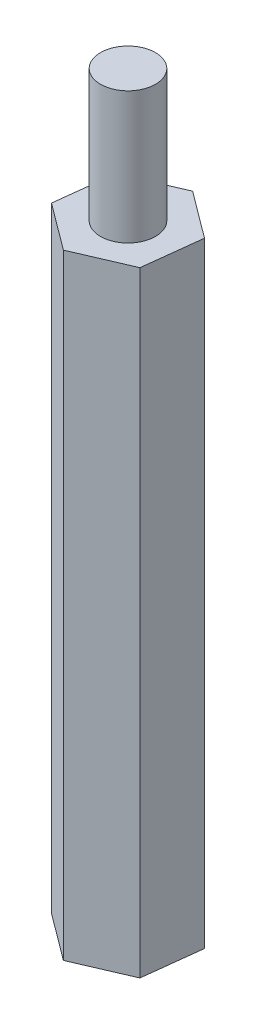
ISO-10303-21;
HEADER;
FILE_DESCRIPTION(('STEP AP214'),'2;1');
FILE_NAME('part.step','',(''),(''),'','','');
FILE_SCHEMA(('AUTOMOTIVE_DESIGN { 1 0 10303 214 1 1 1 1 }'));
ENDSEC;
DATA;
#1=APPLICATION_CONTEXT('core data for automotive mechanical design processes');
#2=APPLICATION_PROTOCOL_DEFINITION('international standard','automotive_design',2000,#1);
#3=PRODUCT_CONTEXT('',#1,'mechanical');
#4=PRODUCT('Part','Part','',(#3));
#5=PRODUCT_RELATED_PRODUCT_CATEGORY('part','',(#4));
#6=PRODUCT_DEFINITION_FORMATION('','',#4);
#7=PRODUCT_DEFINITION_CONTEXT('part definition',#1,'design');
#8=PRODUCT_DEFINITION('design','',#6,#7);
#9=PRODUCT_DEFINITION_SHAPE('','',#8);
#10=(LENGTH_UNIT() NAMED_UNIT(*) SI_UNIT(.MILLI.,.METRE.));
#11=(NAMED_UNIT(*) PLANE_ANGLE_UNIT() SI_UNIT($,.RADIAN.));
#12=(NAMED_UNIT(*) SI_UNIT($,.STERADIAN.) SOLID_ANGLE_UNIT());
#13=UNCERTAINTY_MEASURE_WITH_UNIT(LENGTH_MEASURE(1.E-05),#10,'distance_accuracy_value','');
#14=(GEOMETRIC_REPRESENTATION_CONTEXT(3) GLOBAL_UNCERTAINTY_ASSIGNED_CONTEXT((#13)) GLOBAL_UNIT_ASSIGNED_CONTEXT((#10,
#11,#12)) REPRESENTATION_CONTEXT('',''));
#15=CARTESIAN_POINT('',(0.,0.,0.));
#16=DIRECTION('',(0.,0.,1.));
#17=DIRECTION('',(1.,0.,0.));
#18=AXIS2_PLACEMENT_3D('',#15,#16,#17);
#19=CARTESIAN_POINT('',(-0.30848263547383,28.,2.63198375063584));
#20=DIRECTION('',(-0.395787953347626,0.,-0.918341927598265));
#21=DIRECTION('',(-0.918341927598265,0.,0.395787953347627));
#22=AXIS2_PLACEMENT_3D('',#19,#20,#21);
#23=PLANE('',#22);
#24=DIRECTION('',(0.918341927598265,0.,-0.395787953347626));
#25=VECTOR('',#24,1.);
#26=CARTESIAN_POINT('',(-0.30848263547383,0.,2.63198375063584));
#27=LINE('',#26,#25);
#28=CARTESIAN_POINT('',(-0.30848263547383,0.,2.63198375063584));
#29=VERTEX_POINT('',#28);
#30=CARTESIAN_POINT('',(2.12512347266157,0.,1.58314567426463));
#31=VERTEX_POINT('',#30);
#32=EDGE_CURVE('E125',#29,#31,#27,.T.);
#33=ORIENTED_EDGE('',*,*,#32,.T.);
#34=DIRECTION('',(0.,-1.,0.));
#35=VECTOR('',#34,1.);
#36=CARTESIAN_POINT('',(2.12512347266157,28.,1.58314567426463));
#37=LINE('',#36,#35);
#38=CARTESIAN_POINT('',(2.12512347266157,28.,1.58314567426463));
#39=VERTEX_POINT('',#38);
#40=EDGE_CURVE('E42',#39,#31,#37,.T.);
#41=ORIENTED_EDGE('',*,*,#40,.F.);
#42=DIRECTION('',(0.918341927598265,0.,-0.395787953347626));
#43=VECTOR('',#42,1.);
#44=CARTESIAN_POINT('',(-0.30848263547383,28.,2.63198375063584));
#45=LINE('',#44,#43);
#46=CARTESIAN_POINT('',(-0.30848263547383,28.,2.63198375063584));
#47=VERTEX_POINT('',#46);
#48=EDGE_CURVE('E136',#47,#39,#45,.T.);
#49=ORIENTED_EDGE('',*,*,#48,.F.);
#50=DIRECTION('',(0.,-1.,0.));
#51=VECTOR('',#50,1.);
#52=CARTESIAN_POINT('',(-0.30848263547383,28.,2.63198375063584));
#53=LINE('',#52,#51);
#54=EDGE_CURVE('E121',#47,#29,#53,.T.);
#55=ORIENTED_EDGE('',*,*,#54,.T.);
#56=EDGE_LOOP('',(#33,#41,#49,#55));
#57=FACE_BOUND('',#56,.T.);
#58=ADVANCED_FACE('F39',(#57),#23,.F.);
#59=CARTESIAN_POINT('',(2.12512347266157,28.,1.58314567426463));
#60=DIRECTION('',(-0.993201415334281,0.,-0.116408541688238));
#61=DIRECTION('',(-0.116408541688238,0.,0.993201415334281));
#62=AXIS2_PLACEMENT_3D('',#59,#60,#61);
#63=PLANE('',#62);
#64=DIRECTION('',(0.116408541688238,0.,-0.99320141533428));
#65=VECTOR('',#64,1.);
#66=CARTESIAN_POINT('',(2.12512347266157,0.,1.58314567426463));
#67=LINE('',#66,#65);
#68=CARTESIAN_POINT('',(2.4336061081354,0.,-1.04883807637121));
#69=VERTEX_POINT('',#68);
#70=EDGE_CURVE('E128',#31,#69,#67,.T.);
#71=ORIENTED_EDGE('',*,*,#70,.T.);
#72=DIRECTION('',(0.,-1.,0.));
#73=VECTOR('',#72,1.);
#74=CARTESIAN_POINT('',(2.4336061081354,28.,-1.04883807637121));
#75=LINE('',#74,#73);
#76=CARTESIAN_POINT('',(2.4336061081354,28.,-1.04883807637121));
#77=VERTEX_POINT('',#76);
#78=EDGE_CURVE('E139',#77,#69,#75,.T.);
#79=ORIENTED_EDGE('',*,*,#78,.F.);
#80=DIRECTION('',(0.116408541688238,0.,-0.99320141533428));
#81=VECTOR('',#80,1.);
#82=CARTESIAN_POINT('',(2.12512347266157,28.,1.58314567426463));
#83=LINE('',#82,#81);
#84=EDGE_CURVE('E94',#39,#77,#83,.T.);
#85=ORIENTED_EDGE('',*,*,#84,.F.);
#86=ORIENTED_EDGE('',*,*,#40,.T.);
#87=EDGE_LOOP('',(#71,#79,#85,#86));
#88=FACE_BOUND('',#87,.T.);
#89=ADVANCED_FACE('F144',(#88),#63,.F.);
#90=CARTESIAN_POINT('',(2.4336061081354,28.,-1.04883807637121));
#91=DIRECTION('',(-0.597413461986654,0.,0.801933385910027));
#92=DIRECTION('',(0.801933385910027,0.,0.597413461986654));
#93=AXIS2_PLACEMENT_3D('',#90,#91,#92);
#94=PLANE('',#93);
#95=DIRECTION('',(-0.801933385910027,0.,-0.597413461986654));
#96=VECTOR('',#95,1.);
#97=CARTESIAN_POINT('',(2.4336061081354,0.,-1.04883807637121));
#98=LINE('',#97,#96);
#99=CARTESIAN_POINT('',(0.308482635473831,0.,-2.63198375063584));
#100=VERTEX_POINT('',#99);
#101=EDGE_CURVE('E131',#69,#100,#98,.T.);
#102=ORIENTED_EDGE('',*,*,#101,.T.);
#103=DIRECTION('',(0.,-1.,0.));
#104=VECTOR('',#103,1.);
#105=CARTESIAN_POINT('',(0.308482635473831,28.,-2.63198375063584));
#106=LINE('',#105,#104);
#107=CARTESIAN_POINT('',(0.308482635473831,28.,-2.63198375063584));
#108=VERTEX_POINT('',#107);
#109=EDGE_CURVE('E116',#108,#100,#106,.T.);
#110=ORIENTED_EDGE('',*,*,#109,.F.);
#111=DIRECTION('',(-0.801933385910027,0.,-0.597413461986654));
#112=VECTOR('',#111,1.);
#113=CARTESIAN_POINT('',(2.4336061081354,28.,-1.04883807637121));
#114=LINE('',#113,#112);
#115=EDGE_CURVE('E107',#77,#108,#114,.T.);
#116=ORIENTED_EDGE('',*,*,#115,.F.);
#117=ORIENTED_EDGE('',*,*,#78,.T.);
#118=EDGE_LOOP('',(#102,#110,#116,#117));
#119=FACE_BOUND('',#118,.T.);
#120=ADVANCED_FACE('F150',(#119),#94,.F.);
#121=CARTESIAN_POINT('',(0.308482635473831,28.,-2.63198375063584));
#122=DIRECTION('',(0.395787953347626,0.,0.918341927598265));
#123=DIRECTION('',(0.918341927598265,0.,-0.395787953347626));
#124=AXIS2_PLACEMENT_3D('',#121,#122,#123);
#125=PLANE('',#124);
#126=DIRECTION('',(-0.918341927598265,0.,0.395787953347626));
#127=VECTOR('',#126,1.);
#128=CARTESIAN_POINT('',(0.308482635473831,0.,-2.63198375063584));
#129=LINE('',#128,#127);
#130=CARTESIAN_POINT('',(-2.12512347266157,0.,-1.58314567426463));
#131=VERTEX_POINT('',#130);
#132=EDGE_CURVE('E115',#100,#131,#129,.T.);
#133=ORIENTED_EDGE('',*,*,#132,.T.);
#134=DIRECTION('',(0.,-1.,0.));
#135=VECTOR('',#134,1.);
#136=CARTESIAN_POINT('',(-2.12512347266157,28.,-1.58314567426463));
#137=LINE('',#136,#135);
#138=CARTESIAN_POINT('',(-2.12512347266157,28.,-1.58314567426463));
#139=VERTEX_POINT('',#138);
#140=EDGE_CURVE('E112',#139,#131,#137,.T.);
#141=ORIENTED_EDGE('',*,*,#140,.F.);
#142=DIRECTION('',(-0.918341927598265,0.,0.395787953347626));
#143=VECTOR('',#142,1.);
#144=CARTESIAN_POINT('',(0.308482635473831,28.,-2.63198375063584));
#145=LINE('',#144,#143);
#146=EDGE_CURVE('E101',#108,#139,#145,.T.);
#147=ORIENTED_EDGE('',*,*,#146,.F.);
#148=ORIENTED_EDGE('',*,*,#109,.T.);
#149=EDGE_LOOP('',(#133,#141,#147,#148));
#150=FACE_BOUND('',#149,.T.);
#151=ADVANCED_FACE('F113',(#150),#125,.F.);
#152=CARTESIAN_POINT('',(-2.12512347266157,28.,-1.58314567426463));
#153=DIRECTION('',(0.993201415334281,0.,0.116408541688238));
#154=DIRECTION('',(0.116408541688238,0.,-0.993201415334281));
#155=AXIS2_PLACEMENT_3D('',#152,#153,#154);
#156=PLANE('',#155);
#157=DIRECTION('',(-0.116408541688238,0.,0.99320141533428));
#158=VECTOR('',#157,1.);
#159=CARTESIAN_POINT('',(-2.12512347266157,0.,-1.58314567426463));
#160=LINE('',#159,#158);
#161=CARTESIAN_POINT('',(-2.4336061081354,0.,1.04883807637121));
#162=VERTEX_POINT('',#161);
#163=EDGE_CURVE('E79',#131,#162,#160,.T.);
#164=ORIENTED_EDGE('',*,*,#163,.T.);
#165=DIRECTION('',(0.,-1.,0.));
#166=VECTOR('',#165,1.);
#167=CARTESIAN_POINT('',(-2.4336061081354,28.,1.04883807637121));
#168=LINE('',#167,#166);
#169=CARTESIAN_POINT('',(-2.4336061081354,28.,1.04883807637121));
#170=VERTEX_POINT('',#169);
#171=EDGE_CURVE('E117',#170,#162,#168,.T.);
#172=ORIENTED_EDGE('',*,*,#171,.F.);
#173=DIRECTION('',(-0.116408541688238,0.,0.99320141533428));
#174=VECTOR('',#173,1.);
#175=CARTESIAN_POINT('',(-2.12512347266157,28.,-1.58314567426463));
#176=LINE('',#175,#174);
#177=EDGE_CURVE('E105',#139,#170,#176,.T.);
#178=ORIENTED_EDGE('',*,*,#177,.F.);
#179=ORIENTED_EDGE('',*,*,#140,.T.);
#180=EDGE_LOOP('',(#164,#172,#178,#179));
#181=FACE_BOUND('',#180,.T.);
#182=ADVANCED_FACE('F119',(#181),#156,.F.);
#183=CARTESIAN_POINT('',(-2.4336061081354,28.,1.04883807637121));
#184=DIRECTION('',(0.597413461986654,0.,-0.801933385910027));
#185=DIRECTION('',(-0.801933385910027,0.,-0.597413461986654));
#186=AXIS2_PLACEMENT_3D('',#183,#184,#185);
#187=PLANE('',#186);
#188=DIRECTION('',(0.801933385910027,0.,0.597413461986654));
#189=VECTOR('',#188,1.);
#190=CARTESIAN_POINT('',(-2.4336061081354,0.,1.04883807637121));
#191=LINE('',#190,#189);
#192=EDGE_CURVE('E85',#162,#29,#191,.T.);
#193=ORIENTED_EDGE('',*,*,#192,.T.);
#194=ORIENTED_EDGE('',*,*,#54,.F.);
#195=DIRECTION('',(0.801933385910027,0.,0.597413461986654));
#196=VECTOR('',#195,1.);
#197=CARTESIAN_POINT('',(-2.4336061081354,28.,1.04883807637121));
#198=LINE('',#197,#196);
#199=EDGE_CURVE('E56',#170,#47,#198,.T.);
#200=ORIENTED_EDGE('',*,*,#199,.F.);
#201=ORIENTED_EDGE('',*,*,#171,.T.);
#202=EDGE_LOOP('',(#193,#194,#200,#201));
#203=FACE_BOUND('',#202,.T.);
#204=ADVANCED_FACE('F181',(#203),#187,.F.);
#205=CARTESIAN_POINT('',(0.,28.,0.));
#206=DIRECTION('',(0.,1.,0.));
#207=DIRECTION('',(0.,0.,1.));
#208=AXIS2_PLACEMENT_3D('',#205,#206,#207);
#209=PLANE('',#208);
#210=CARTESIAN_POINT('',(0.,28.,0.));
#211=DIRECTION('',(0.,1.,0.));
#212=DIRECTION('',(0.,0.,1.));
#213=AXIS2_PLACEMENT_3D('',#210,#211,#212);
#214=CIRCLE('',#213,1.25);
#215=CARTESIAN_POINT('',(0.,28.,1.25));
#216=VERTEX_POINT('',#215);
#217=EDGE_CURVE('E11',#216,#216,#214,.T.);
#218=ORIENTED_EDGE('',*,*,#217,.F.);
#219=EDGE_LOOP('',(#218));
#220=FACE_BOUND('',#219,.T.);
#221=ORIENTED_EDGE('',*,*,#48,.T.);
#222=ORIENTED_EDGE('',*,*,#84,.T.);
#223=ORIENTED_EDGE('',*,*,#115,.T.);
#224=ORIENTED_EDGE('',*,*,#146,.T.);
#225=ORIENTED_EDGE('',*,*,#177,.T.);
#226=ORIENTED_EDGE('',*,*,#199,.T.);
#227=EDGE_LOOP('',(#221,#222,#223,#224,#225,#226));
#228=FACE_BOUND('',#227,.T.);
#229=ADVANCED_FACE('F103',(#220,#228),#209,.T.);
#230=CARTESIAN_POINT('',(0.,0.,0.));
#231=DIRECTION('',(0.,1.,0.));
#232=DIRECTION('',(0.,0.,1.));
#233=AXIS2_PLACEMENT_3D('',#230,#231,#232);
#234=PLANE('',#233);
#235=CARTESIAN_POINT('',(0.,0.,0.));
#236=DIRECTION('',(0.,-1.,0.));
#237=DIRECTION('',(0.,0.,-1.));
#238=AXIS2_PLACEMENT_3D('',#235,#236,#237);
#239=CIRCLE('',#238,1.25);
#240=CARTESIAN_POINT('',(0.,0.,-1.25));
#241=VERTEX_POINT('',#240);
#242=EDGE_CURVE('E157',#241,#241,#239,.T.);
#243=ORIENTED_EDGE('',*,*,#242,.F.);
#244=EDGE_LOOP('',(#243));
#245=FACE_BOUND('',#244,.T.);
#246=ORIENTED_EDGE('',*,*,#32,.F.);
#247=ORIENTED_EDGE('',*,*,#192,.F.);
#248=ORIENTED_EDGE('',*,*,#163,.F.);
#249=ORIENTED_EDGE('',*,*,#132,.F.);
#250=ORIENTED_EDGE('',*,*,#101,.F.);
#251=ORIENTED_EDGE('',*,*,#70,.F.);
#252=EDGE_LOOP('',(#246,#247,#248,#249,#250,#251));
#253=FACE_BOUND('',#252,.T.);
#254=ADVANCED_FACE('F149',(#245,#253),#234,.F.);
#255=CARTESIAN_POINT('',(0.,34.,0.));
#256=DIRECTION('',(0.,-1.,0.));
#257=DIRECTION('',(0.,0.,-1.));
#258=AXIS2_PLACEMENT_3D('',#255,#256,#257);
#259=CYLINDRICAL_SURFACE('',#258,1.25);
#260=CARTESIAN_POINT('',(0.,34.,0.));
#261=DIRECTION('',(0.,1.,0.));
#262=DIRECTION('',(0.,0.,1.));
#263=AXIS2_PLACEMENT_3D('',#260,#261,#262);
#264=CIRCLE('',#263,1.25);
#265=CARTESIAN_POINT('',(0.,34.,1.25));
#266=VERTEX_POINT('',#265);
#267=EDGE_CURVE('E129',#266,#266,#264,.T.);
#268=ORIENTED_EDGE('',*,*,#267,.F.);
#269=EDGE_LOOP('',(#268));
#270=FACE_BOUND('',#269,.T.);
#271=ORIENTED_EDGE('',*,*,#217,.T.);
#272=EDGE_LOOP('',(#271));
#273=FACE_BOUND('',#272,.T.);
#274=ADVANCED_FACE('F173',(#270,#273),#259,.T.);
#275=CARTESIAN_POINT('',(0.,34.,0.));
#276=DIRECTION('',(0.,1.,0.));
#277=DIRECTION('',(0.,0.,1.));
#278=AXIS2_PLACEMENT_3D('',#275,#276,#277);
#279=PLANE('',#278);
#280=ORIENTED_EDGE('',*,*,#267,.T.);
#281=EDGE_LOOP('',(#280));
#282=FACE_BOUND('',#281,.T.);
#283=ADVANCED_FACE('F168',(#282),#279,.T.);
#284=CARTESIAN_POINT('',(0.,6.,0.));
#285=DIRECTION('',(0.,-1.,0.));
#286=DIRECTION('',(0.,0.,-1.));
#287=AXIS2_PLACEMENT_3D('',#284,#285,#286);
#288=CYLINDRICAL_SURFACE('',#287,1.25);
#289=CARTESIAN_POINT('',(0.,6.,0.));
#290=DIRECTION('',(0.,-1.,0.));
#291=DIRECTION('',(0.,0.,-1.));
#292=AXIS2_PLACEMENT_3D('',#289,#290,#291);
#293=CIRCLE('',#292,1.25);
#294=CARTESIAN_POINT('',(0.,6.,-1.25));
#295=VERTEX_POINT('',#294);
#296=EDGE_CURVE('E156',#295,#295,#293,.T.);
#297=ORIENTED_EDGE('',*,*,#296,.F.);
#298=EDGE_LOOP('',(#297));
#299=FACE_BOUND('',#298,.T.);
#300=ORIENTED_EDGE('',*,*,#242,.T.);
#301=EDGE_LOOP('',(#300));
#302=FACE_BOUND('',#301,.T.);
#303=ADVANCED_FACE('F165',(#299,#302),#288,.F.);
#304=CARTESIAN_POINT('',(0.,6.,0.));
#305=DIRECTION('',(0.,-1.,0.));
#306=DIRECTION('',(0.,0.,-1.));
#307=AXIS2_PLACEMENT_3D('',#304,#305,#306);
#308=PLANE('',#307);
#309=ORIENTED_EDGE('',*,*,#296,.T.);
#310=EDGE_LOOP('',(#309));
#311=FACE_BOUND('',#310,.T.);
#312=ADVANCED_FACE('F163',(#311),#308,.T.);
#313=CLOSED_SHELL('',(#58,#89,#120,#151,#182,#204,#229,#254,#274,#283,#303,#312));
#314=MANIFOLD_SOLID_BREP('B2',#313);
#315=ADVANCED_BREP_SHAPE_REPRESENTATION('',(#18,#314),#14);
#316=SHAPE_DEFINITION_REPRESENTATION(#9,#315);
ENDSEC;
END-ISO-10303-21;
